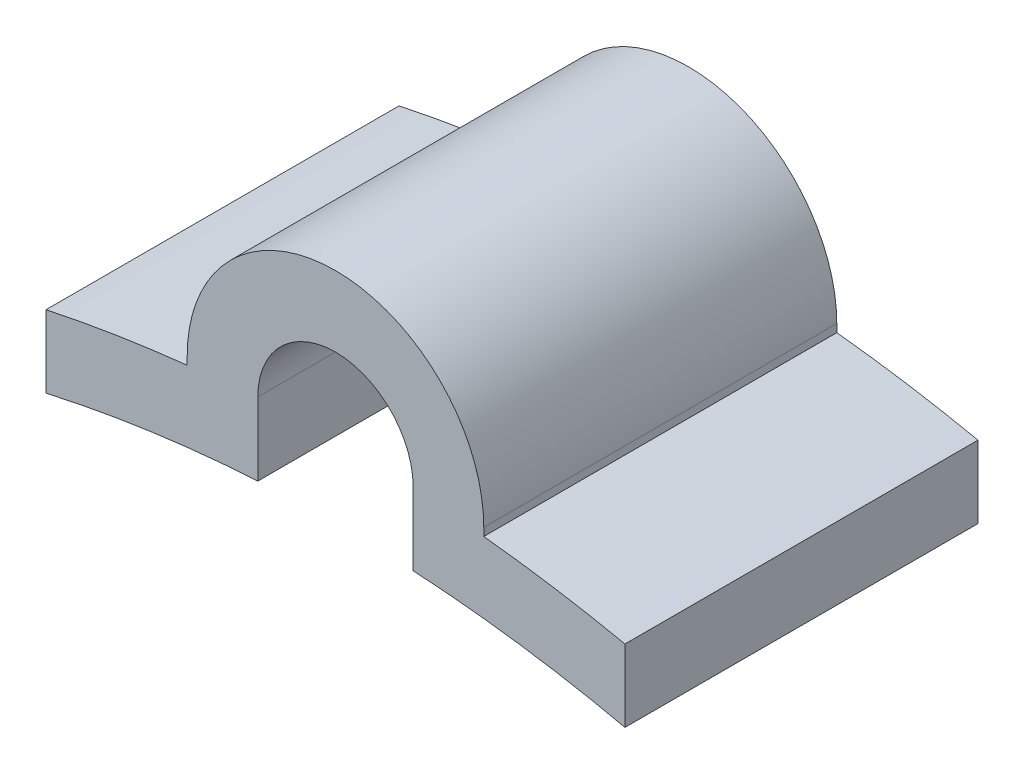
ISO-10303-21;
HEADER;
FILE_DESCRIPTION(('STEP AP214'),'2;1');
FILE_NAME('part.step','',(''),(''),'','','');
FILE_SCHEMA(('AUTOMOTIVE_DESIGN { 1 0 10303 214 1 1 1 1 }'));
ENDSEC;
DATA;
#1=APPLICATION_CONTEXT('core data for automotive mechanical design processes');
#2=APPLICATION_PROTOCOL_DEFINITION('international standard','automotive_design',2000,#1);
#3=PRODUCT_CONTEXT('',#1,'mechanical');
#4=PRODUCT('Part','Part','',(#3));
#5=PRODUCT_RELATED_PRODUCT_CATEGORY('part','',(#4));
#6=PRODUCT_DEFINITION_FORMATION('','',#4);
#7=PRODUCT_DEFINITION_CONTEXT('part definition',#1,'design');
#8=PRODUCT_DEFINITION('design','',#6,#7);
#9=PRODUCT_DEFINITION_SHAPE('','',#8);
#10=(LENGTH_UNIT() NAMED_UNIT(*) SI_UNIT(.MILLI.,.METRE.));
#11=(NAMED_UNIT(*) PLANE_ANGLE_UNIT() SI_UNIT($,.RADIAN.));
#12=(NAMED_UNIT(*) SI_UNIT($,.STERADIAN.) SOLID_ANGLE_UNIT());
#13=UNCERTAINTY_MEASURE_WITH_UNIT(LENGTH_MEASURE(1.E-05),#10,'distance_accuracy_value','');
#14=(GEOMETRIC_REPRESENTATION_CONTEXT(3) GLOBAL_UNCERTAINTY_ASSIGNED_CONTEXT((#13)) GLOBAL_UNIT_ASSIGNED_CONTEXT((#10,
#11,#12)) REPRESENTATION_CONTEXT('',''));
#15=CARTESIAN_POINT('',(0.,0.,0.));
#16=DIRECTION('',(0.,0.,1.));
#17=DIRECTION('',(1.,0.,0.));
#18=AXIS2_PLACEMENT_3D('',#15,#16,#17);
#19=CARTESIAN_POINT('',(4.2,0.,10.));
#20=DIRECTION('',(1.,0.,0.));
#21=DIRECTION('',(0.,0.,-1.));
#22=AXIS2_PLACEMENT_3D('',#19,#20,#21);
#23=PLANE('',#22);
#24=DIRECTION('',(0.,-1.,0.));
#25=VECTOR('',#24,1.);
#26=CARTESIAN_POINT('',(4.2,0.,0.));
#27=LINE('',#26,#25);
#28=CARTESIAN_POINT('',(4.2,0.,0.));
#29=VERTEX_POINT('',#28);
#30=CARTESIAN_POINT('',(4.2,-0.223925858100327,0.));
#31=VERTEX_POINT('',#30);
#32=EDGE_CURVE('E159',#29,#31,#27,.T.);
#33=ORIENTED_EDGE('',*,*,#32,.F.);
#34=DIRECTION('',(0.,0.,-1.));
#35=VECTOR('',#34,1.);
#36=CARTESIAN_POINT('',(4.2,0.,10.));
#37=LINE('',#36,#35);
#38=CARTESIAN_POINT('',(4.2,0.,10.));
#39=VERTEX_POINT('',#38);
#40=EDGE_CURVE('E11',#39,#29,#37,.T.);
#41=ORIENTED_EDGE('',*,*,#40,.F.);
#42=DIRECTION('',(0.,-1.,0.));
#43=VECTOR('',#42,1.);
#44=CARTESIAN_POINT('',(4.2,0.,10.));
#45=LINE('',#44,#43);
#46=CARTESIAN_POINT('',(4.2,-0.223925858100327,10.));
#47=VERTEX_POINT('',#46);
#48=EDGE_CURVE('E189',#39,#47,#45,.T.);
#49=ORIENTED_EDGE('',*,*,#48,.T.);
#50=DIRECTION('',(0.,0.,-1.));
#51=VECTOR('',#50,1.);
#52=CARTESIAN_POINT('',(4.2,-0.223925858100327,10.));
#53=LINE('',#52,#51);
#54=EDGE_CURVE('E40',#47,#31,#53,.T.);
#55=ORIENTED_EDGE('',*,*,#54,.T.);
#56=EDGE_LOOP('',(#33,#41,#49,#55));
#57=FACE_BOUND('',#56,.T.);
#58=ADVANCED_FACE('F37',(#57),#23,.T.);
#59=CARTESIAN_POINT('',(0.,0.,10.));
#60=DIRECTION('',(0.,0.,-1.));
#61=DIRECTION('',(-1.,0.,0.));
#62=AXIS2_PLACEMENT_3D('',#59,#60,#61);
#63=CYLINDRICAL_SURFACE('',#62,4.2);
#64=CARTESIAN_POINT('',(0.,0.,0.));
#65=DIRECTION('',(0.,0.,1.));
#66=DIRECTION('',(1.,0.,0.));
#67=AXIS2_PLACEMENT_3D('',#64,#65,#66);
#68=CIRCLE('',#67,4.2);
#69=CARTESIAN_POINT('',(-4.2,0.,0.));
#70=VERTEX_POINT('',#69);
#71=EDGE_CURVE('E94',#29,#70,#68,.T.);
#72=ORIENTED_EDGE('',*,*,#71,.T.);
#73=DIRECTION('',(0.,0.,-1.));
#74=VECTOR('',#73,1.);
#75=CARTESIAN_POINT('',(-4.2,0.,10.));
#76=LINE('',#75,#74);
#77=CARTESIAN_POINT('',(-4.2,0.,10.));
#78=VERTEX_POINT('',#77);
#79=EDGE_CURVE('E46',#78,#70,#76,.T.);
#80=ORIENTED_EDGE('',*,*,#79,.F.);
#81=CARTESIAN_POINT('',(0.,0.,10.));
#82=DIRECTION('',(0.,0.,1.));
#83=DIRECTION('',(1.,0.,0.));
#84=AXIS2_PLACEMENT_3D('',#81,#82,#83);
#85=CIRCLE('',#84,4.2);
#86=EDGE_CURVE('E137',#39,#78,#85,.T.);
#87=ORIENTED_EDGE('',*,*,#86,.F.);
#88=ORIENTED_EDGE('',*,*,#40,.T.);
#89=EDGE_LOOP('',(#72,#80,#87,#88));
#90=FACE_BOUND('',#89,.T.);
#91=ADVANCED_FACE('F263',(#90),#63,.T.);
#92=CARTESIAN_POINT('',(-4.2,0.,10.));
#93=DIRECTION('',(1.,0.,0.));
#94=DIRECTION('',(0.,0.,-1.));
#95=AXIS2_PLACEMENT_3D('',#92,#93,#94);
#96=PLANE('',#95);
#97=DIRECTION('',(0.,-1.,0.));
#98=VECTOR('',#97,1.);
#99=CARTESIAN_POINT('',(-4.2,0.,0.));
#100=LINE('',#99,#98);
#101=CARTESIAN_POINT('',(-4.2,-0.223925858100327,0.));
#102=VERTEX_POINT('',#101);
#103=EDGE_CURVE('E144',#70,#102,#100,.T.);
#104=ORIENTED_EDGE('',*,*,#103,.T.);
#105=DIRECTION('',(0.,0.,-1.));
#106=VECTOR('',#105,1.);
#107=CARTESIAN_POINT('',(-4.2,-0.223925858100327,10.));
#108=LINE('',#107,#106);
#109=CARTESIAN_POINT('',(-4.2,-0.223925858100327,10.));
#110=VERTEX_POINT('',#109);
#111=EDGE_CURVE('E141',#110,#102,#108,.T.);
#112=ORIENTED_EDGE('',*,*,#111,.F.);
#113=DIRECTION('',(0.,-1.,0.));
#114=VECTOR('',#113,1.);
#115=CARTESIAN_POINT('',(-4.2,0.,10.));
#116=LINE('',#115,#114);
#117=EDGE_CURVE('E131',#78,#110,#116,.T.);
#118=ORIENTED_EDGE('',*,*,#117,.F.);
#119=ORIENTED_EDGE('',*,*,#79,.T.);
#120=EDGE_LOOP('',(#104,#112,#118,#119));
#121=FACE_BOUND('',#120,.T.);
#122=ADVANCED_FACE('F142',(#121),#96,.F.);
#123=CARTESIAN_POINT('',(0.,-39.5,10.));
#124=DIRECTION('',(0.,0.,-1.));
#125=DIRECTION('',(-1.,0.,0.));
#126=AXIS2_PLACEMENT_3D('',#123,#124,#125);
#127=CYLINDRICAL_SURFACE('',#126,39.5);
#128=CARTESIAN_POINT('',(0.,-39.5,0.));
#129=DIRECTION('',(0.,0.,1.));
#130=DIRECTION('',(1.,0.,0.));
#131=AXIS2_PLACEMENT_3D('',#128,#129,#130);
#132=CIRCLE('',#131,39.5);
#133=CARTESIAN_POINT('',(-8.2,-0.860512425758027,0.));
#134=VERTEX_POINT('',#133);
#135=EDGE_CURVE('E186',#102,#134,#132,.T.);
#136=ORIENTED_EDGE('',*,*,#135,.T.);
#137=DIRECTION('',(0.,0.,-1.));
#138=VECTOR('',#137,1.);
#139=CARTESIAN_POINT('',(-8.2,-0.860512425758027,10.));
#140=LINE('',#139,#138);
#141=CARTESIAN_POINT('',(-8.2,-0.860512425758027,10.));
#142=VERTEX_POINT('',#141);
#143=EDGE_CURVE('E147',#142,#134,#140,.T.);
#144=ORIENTED_EDGE('',*,*,#143,.F.);
#145=CARTESIAN_POINT('',(0.,-39.5,10.));
#146=DIRECTION('',(0.,0.,1.));
#147=DIRECTION('',(1.,0.,0.));
#148=AXIS2_PLACEMENT_3D('',#145,#146,#147);
#149=CIRCLE('',#148,39.5);
#150=EDGE_CURVE('E135',#110,#142,#149,.T.);
#151=ORIENTED_EDGE('',*,*,#150,.F.);
#152=ORIENTED_EDGE('',*,*,#111,.T.);
#153=EDGE_LOOP('',(#136,#144,#151,#152));
#154=FACE_BOUND('',#153,.T.);
#155=ADVANCED_FACE('F149',(#154),#127,.T.);
#156=CARTESIAN_POINT('',(-8.2,-0.860512425758028,10.));
#157=DIRECTION('',(1.,0.,0.));
#158=DIRECTION('',(0.,0.,-1.));
#159=AXIS2_PLACEMENT_3D('',#156,#157,#158);
#160=PLANE('',#159);
#161=DIRECTION('',(0.,-1.,0.));
#162=VECTOR('',#161,1.);
#163=CARTESIAN_POINT('',(-8.2,-0.860512425758028,0.));
#164=LINE('',#163,#162);
#165=CARTESIAN_POINT('',(-8.2,-2.90751443260516,0.));
#166=VERTEX_POINT('',#165);
#167=EDGE_CURVE('E183',#134,#166,#164,.T.);
#168=ORIENTED_EDGE('',*,*,#167,.T.);
#169=DIRECTION('',(0.,0.,-1.));
#170=VECTOR('',#169,1.);
#171=CARTESIAN_POINT('',(-8.2,-2.90751443260516,10.));
#172=LINE('',#171,#170);
#173=CARTESIAN_POINT('',(-8.2,-2.90751443260516,10.));
#174=VERTEX_POINT('',#173);
#175=EDGE_CURVE('E193',#174,#166,#172,.T.);
#176=ORIENTED_EDGE('',*,*,#175,.F.);
#177=DIRECTION('',(0.,-1.,0.));
#178=VECTOR('',#177,1.);
#179=CARTESIAN_POINT('',(-8.2,-0.860512425758028,10.));
#180=LINE('',#179,#178);
#181=EDGE_CURVE('E152',#142,#174,#180,.T.);
#182=ORIENTED_EDGE('',*,*,#181,.F.);
#183=ORIENTED_EDGE('',*,*,#143,.T.);
#184=EDGE_LOOP('',(#168,#176,#182,#183));
#185=FACE_BOUND('',#184,.T.);
#186=ADVANCED_FACE('F213',(#185),#160,.F.);
#187=CARTESIAN_POINT('',(0.,-39.5,10.));
#188=DIRECTION('',(0.,0.,-1.));
#189=DIRECTION('',(-1.,0.,0.));
#190=AXIS2_PLACEMENT_3D('',#187,#188,#189);
#191=CYLINDRICAL_SURFACE('',#190,37.5);
#192=CARTESIAN_POINT('',(0.,-39.5,0.));
#193=DIRECTION('',(0.,0.,1.));
#194=DIRECTION('',(1.,0.,0.));
#195=AXIS2_PLACEMENT_3D('',#192,#193,#194);
#196=CIRCLE('',#195,37.5);
#197=CARTESIAN_POINT('',(-2.2,-2.06458895644393,0.));
#198=VERTEX_POINT('',#197);
#199=EDGE_CURVE('E180',#198,#166,#196,.T.);
#200=ORIENTED_EDGE('',*,*,#199,.F.);
#201=DIRECTION('',(0.,0.,-1.));
#202=VECTOR('',#201,1.);
#203=CARTESIAN_POINT('',(-2.2,-2.06458895644393,10.));
#204=LINE('',#203,#202);
#205=CARTESIAN_POINT('',(-2.2,-2.06458895644393,10.));
#206=VERTEX_POINT('',#205);
#207=EDGE_CURVE('E195',#206,#198,#204,.T.);
#208=ORIENTED_EDGE('',*,*,#207,.F.);
#209=CARTESIAN_POINT('',(0.,-39.5,10.));
#210=DIRECTION('',(0.,0.,1.));
#211=DIRECTION('',(1.,0.,0.));
#212=AXIS2_PLACEMENT_3D('',#209,#210,#211);
#213=CIRCLE('',#212,37.5);
#214=EDGE_CURVE('E154',#206,#174,#213,.T.);
#215=ORIENTED_EDGE('',*,*,#214,.T.);
#216=ORIENTED_EDGE('',*,*,#175,.T.);
#217=EDGE_LOOP('',(#200,#208,#215,#216));
#218=FACE_BOUND('',#217,.T.);
#219=ADVANCED_FACE('F253',(#218),#191,.F.);
#220=CARTESIAN_POINT('',(-2.2,0.,10.));
#221=DIRECTION('',(1.,0.,0.));
#222=DIRECTION('',(0.,1.,0.));
#223=AXIS2_PLACEMENT_3D('',#220,#221,#222);
#224=PLANE('',#223);
#225=DIRECTION('',(0.,-1.,0.));
#226=VECTOR('',#225,1.);
#227=CARTESIAN_POINT('',(-2.2,0.,0.));
#228=LINE('',#227,#226);
#229=CARTESIAN_POINT('',(-2.2,0.,0.));
#230=VERTEX_POINT('',#229);
#231=EDGE_CURVE('E177',#230,#198,#228,.T.);
#232=ORIENTED_EDGE('',*,*,#231,.F.);
#233=DIRECTION('',(0.,0.,-1.));
#234=VECTOR('',#233,1.);
#235=CARTESIAN_POINT('',(-2.2,0.,10.));
#236=LINE('',#235,#234);
#237=CARTESIAN_POINT('',(-2.2,0.,10.));
#238=VERTEX_POINT('',#237);
#239=EDGE_CURVE('E197',#238,#230,#236,.T.);
#240=ORIENTED_EDGE('',*,*,#239,.F.);
#241=DIRECTION('',(0.,-1.,0.));
#242=VECTOR('',#241,1.);
#243=CARTESIAN_POINT('',(-2.2,0.,10.));
#244=LINE('',#243,#242);
#245=EDGE_CURVE('E220',#238,#206,#244,.T.);
#246=ORIENTED_EDGE('',*,*,#245,.T.);
#247=ORIENTED_EDGE('',*,*,#207,.T.);
#248=EDGE_LOOP('',(#232,#240,#246,#247));
#249=FACE_BOUND('',#248,.T.);
#250=ADVANCED_FACE('F225',(#249),#224,.T.);
#251=CARTESIAN_POINT('',(0.,0.,10.));
#252=DIRECTION('',(0.,0.,-1.));
#253=DIRECTION('',(-1.,0.,0.));
#254=AXIS2_PLACEMENT_3D('',#251,#252,#253);
#255=CYLINDRICAL_SURFACE('',#254,2.2);
#256=CARTESIAN_POINT('',(0.,0.,0.));
#257=DIRECTION('',(0.,0.,1.));
#258=DIRECTION('',(1.,0.,0.));
#259=AXIS2_PLACEMENT_3D('',#256,#257,#258);
#260=CIRCLE('',#259,2.2);
#261=CARTESIAN_POINT('',(2.2,0.,0.));
#262=VERTEX_POINT('',#261);
#263=EDGE_CURVE('E174',#262,#230,#260,.T.);
#264=ORIENTED_EDGE('',*,*,#263,.F.);
#265=DIRECTION('',(0.,0.,-1.));
#266=VECTOR('',#265,1.);
#267=CARTESIAN_POINT('',(2.2,0.,10.));
#268=LINE('',#267,#266);
#269=CARTESIAN_POINT('',(2.2,0.,10.));
#270=VERTEX_POINT('',#269);
#271=EDGE_CURVE('E199',#270,#262,#268,.T.);
#272=ORIENTED_EDGE('',*,*,#271,.F.);
#273=CARTESIAN_POINT('',(0.,0.,10.));
#274=DIRECTION('',(0.,0.,1.));
#275=DIRECTION('',(1.,0.,0.));
#276=AXIS2_PLACEMENT_3D('',#273,#274,#275);
#277=CIRCLE('',#276,2.2);
#278=EDGE_CURVE('E227',#270,#238,#277,.T.);
#279=ORIENTED_EDGE('',*,*,#278,.T.);
#280=ORIENTED_EDGE('',*,*,#239,.T.);
#281=EDGE_LOOP('',(#264,#272,#279,#280));
#282=FACE_BOUND('',#281,.T.);
#283=ADVANCED_FACE('F252',(#282),#255,.F.);
#284=CARTESIAN_POINT('',(2.2,0.,10.));
#285=DIRECTION('',(1.,0.,0.));
#286=DIRECTION('',(0.,1.,0.));
#287=AXIS2_PLACEMENT_3D('',#284,#285,#286);
#288=PLANE('',#287);
#289=DIRECTION('',(0.,-1.,0.));
#290=VECTOR('',#289,1.);
#291=CARTESIAN_POINT('',(2.2,0.,0.));
#292=LINE('',#291,#290);
#293=CARTESIAN_POINT('',(2.2,-2.06458895644393,0.));
#294=VERTEX_POINT('',#293);
#295=EDGE_CURVE('E171',#262,#294,#292,.T.);
#296=ORIENTED_EDGE('',*,*,#295,.T.);
#297=DIRECTION('',(0.,0.,-1.));
#298=VECTOR('',#297,1.);
#299=CARTESIAN_POINT('',(2.2,-2.06458895644393,10.));
#300=LINE('',#299,#298);
#301=CARTESIAN_POINT('',(2.2,-2.06458895644393,10.));
#302=VERTEX_POINT('',#301);
#303=EDGE_CURVE('E201',#302,#294,#300,.T.);
#304=ORIENTED_EDGE('',*,*,#303,.F.);
#305=DIRECTION('',(0.,-1.,0.));
#306=VECTOR('',#305,1.);
#307=CARTESIAN_POINT('',(2.2,0.,10.));
#308=LINE('',#307,#306);
#309=EDGE_CURVE('E229',#270,#302,#308,.T.);
#310=ORIENTED_EDGE('',*,*,#309,.F.);
#311=ORIENTED_EDGE('',*,*,#271,.T.);
#312=EDGE_LOOP('',(#296,#304,#310,#311));
#313=FACE_BOUND('',#312,.T.);
#314=ADVANCED_FACE('F303',(#313),#288,.F.);
#315=CARTESIAN_POINT('',(0.,-39.5,10.));
#316=DIRECTION('',(0.,0.,-1.));
#317=DIRECTION('',(-1.,0.,0.));
#318=AXIS2_PLACEMENT_3D('',#315,#316,#317);
#319=CYLINDRICAL_SURFACE('',#318,37.5);
#320=CARTESIAN_POINT('',(0.,-39.5,0.));
#321=DIRECTION('',(0.,0.,1.));
#322=DIRECTION('',(1.,0.,0.));
#323=AXIS2_PLACEMENT_3D('',#320,#321,#322);
#324=CIRCLE('',#323,37.5);
#325=CARTESIAN_POINT('',(8.2,-2.90751443260517,0.));
#326=VERTEX_POINT('',#325);
#327=EDGE_CURVE('E168',#326,#294,#324,.T.);
#328=ORIENTED_EDGE('',*,*,#327,.F.);
#329=DIRECTION('',(0.,0.,-1.));
#330=VECTOR('',#329,1.);
#331=CARTESIAN_POINT('',(8.2,-2.90751443260517,10.));
#332=LINE('',#331,#330);
#333=CARTESIAN_POINT('',(8.2,-2.90751443260517,10.));
#334=VERTEX_POINT('',#333);
#335=EDGE_CURVE('E203',#334,#326,#332,.T.);
#336=ORIENTED_EDGE('',*,*,#335,.F.);
#337=CARTESIAN_POINT('',(0.,-39.5,10.));
#338=DIRECTION('',(0.,0.,1.));
#339=DIRECTION('',(1.,0.,0.));
#340=AXIS2_PLACEMENT_3D('',#337,#338,#339);
#341=CIRCLE('',#340,37.5);
#342=EDGE_CURVE('E233',#334,#302,#341,.T.);
#343=ORIENTED_EDGE('',*,*,#342,.T.);
#344=ORIENTED_EDGE('',*,*,#303,.T.);
#345=EDGE_LOOP('',(#328,#336,#343,#344));
#346=FACE_BOUND('',#345,.T.);
#347=ADVANCED_FACE('F247',(#346),#319,.F.);
#348=CARTESIAN_POINT('',(8.2,-0.860512425758026,10.));
#349=DIRECTION('',(1.,0.,0.));
#350=DIRECTION('',(0.,0.,-1.));
#351=AXIS2_PLACEMENT_3D('',#348,#349,#350);
#352=PLANE('',#351);
#353=DIRECTION('',(0.,-1.,0.));
#354=VECTOR('',#353,1.);
#355=CARTESIAN_POINT('',(8.2,-0.860512425758026,0.));
#356=LINE('',#355,#354);
#357=CARTESIAN_POINT('',(8.2,-0.860512425758026,0.));
#358=VERTEX_POINT('',#357);
#359=EDGE_CURVE('E165',#358,#326,#356,.T.);
#360=ORIENTED_EDGE('',*,*,#359,.F.);
#361=DIRECTION('',(0.,0.,-1.));
#362=VECTOR('',#361,1.);
#363=CARTESIAN_POINT('',(8.2,-0.860512425758026,10.));
#364=LINE('',#363,#362);
#365=CARTESIAN_POINT('',(8.2,-0.860512425758026,10.));
#366=VERTEX_POINT('',#365);
#367=EDGE_CURVE('E204',#366,#358,#364,.T.);
#368=ORIENTED_EDGE('',*,*,#367,.F.);
#369=DIRECTION('',(0.,-1.,0.));
#370=VECTOR('',#369,1.);
#371=CARTESIAN_POINT('',(8.2,-0.860512425758026,10.));
#372=LINE('',#371,#370);
#373=EDGE_CURVE('E236',#366,#334,#372,.T.);
#374=ORIENTED_EDGE('',*,*,#373,.T.);
#375=ORIENTED_EDGE('',*,*,#335,.T.);
#376=EDGE_LOOP('',(#360,#368,#374,#375));
#377=FACE_BOUND('',#376,.T.);
#378=ADVANCED_FACE('F241',(#377),#352,.T.);
#379=CARTESIAN_POINT('',(0.,-39.5,10.));
#380=DIRECTION('',(0.,0.,-1.));
#381=DIRECTION('',(-1.,0.,0.));
#382=AXIS2_PLACEMENT_3D('',#379,#380,#381);
#383=CYLINDRICAL_SURFACE('',#382,39.5);
#384=CARTESIAN_POINT('',(0.,-39.5,0.));
#385=DIRECTION('',(0.,0.,1.));
#386=DIRECTION('',(1.,0.,0.));
#387=AXIS2_PLACEMENT_3D('',#384,#385,#386);
#388=CIRCLE('',#387,39.5);
#389=EDGE_CURVE('E162',#358,#31,#388,.T.);
#390=ORIENTED_EDGE('',*,*,#389,.T.);
#391=ORIENTED_EDGE('',*,*,#54,.F.);
#392=CARTESIAN_POINT('',(0.,-39.5,10.));
#393=DIRECTION('',(0.,0.,1.));
#394=DIRECTION('',(1.,0.,0.));
#395=AXIS2_PLACEMENT_3D('',#392,#393,#394);
#396=CIRCLE('',#395,39.5);
#397=EDGE_CURVE('E104',#366,#47,#396,.T.);
#398=ORIENTED_EDGE('',*,*,#397,.F.);
#399=ORIENTED_EDGE('',*,*,#367,.T.);
#400=EDGE_LOOP('',(#390,#391,#398,#399));
#401=FACE_BOUND('',#400,.T.);
#402=ADVANCED_FACE('F207',(#401),#383,.T.);
#403=CARTESIAN_POINT('',(0.,-39.5,10.));
#404=DIRECTION('',(0.,0.,1.));
#405=DIRECTION('',(1.,0.,0.));
#406=AXIS2_PLACEMENT_3D('',#403,#404,#405);
#407=PLANE('',#406);
#408=ORIENTED_EDGE('',*,*,#48,.F.);
#409=ORIENTED_EDGE('',*,*,#86,.T.);
#410=ORIENTED_EDGE('',*,*,#117,.T.);
#411=ORIENTED_EDGE('',*,*,#150,.T.);
#412=ORIENTED_EDGE('',*,*,#181,.T.);
#413=ORIENTED_EDGE('',*,*,#214,.F.);
#414=ORIENTED_EDGE('',*,*,#245,.F.);
#415=ORIENTED_EDGE('',*,*,#278,.F.);
#416=ORIENTED_EDGE('',*,*,#309,.T.);
#417=ORIENTED_EDGE('',*,*,#342,.F.);
#418=ORIENTED_EDGE('',*,*,#373,.F.);
#419=ORIENTED_EDGE('',*,*,#397,.T.);
#420=EDGE_LOOP('',(#408,#409,#410,#411,#412,#413,#414,#415,#416,#417,#418,#419));
#421=FACE_BOUND('',#420,.T.);
#422=ADVANCED_FACE('F133',(#421),#407,.T.);
#423=CARTESIAN_POINT('',(0.,-39.5,0.));
#424=DIRECTION('',(0.,0.,1.));
#425=DIRECTION('',(1.,0.,0.));
#426=AXIS2_PLACEMENT_3D('',#423,#424,#425);
#427=PLANE('',#426);
#428=ORIENTED_EDGE('',*,*,#32,.T.);
#429=ORIENTED_EDGE('',*,*,#389,.F.);
#430=ORIENTED_EDGE('',*,*,#359,.T.);
#431=ORIENTED_EDGE('',*,*,#327,.T.);
#432=ORIENTED_EDGE('',*,*,#295,.F.);
#433=ORIENTED_EDGE('',*,*,#263,.T.);
#434=ORIENTED_EDGE('',*,*,#231,.T.);
#435=ORIENTED_EDGE('',*,*,#199,.T.);
#436=ORIENTED_EDGE('',*,*,#167,.F.);
#437=ORIENTED_EDGE('',*,*,#135,.F.);
#438=ORIENTED_EDGE('',*,*,#103,.F.);
#439=ORIENTED_EDGE('',*,*,#71,.F.);
#440=EDGE_LOOP('',(#428,#429,#430,#431,#432,#433,#434,#435,#436,#437,#438,#439));
#441=FACE_BOUND('',#440,.T.);
#442=ADVANCED_FACE('F210',(#441),#427,.F.);
#443=CLOSED_SHELL('',(#58,#91,#122,#155,#186,#219,#250,#283,#314,#347,#378,#402,#422,#442));
#444=MANIFOLD_SOLID_BREP('B2',#443);
#445=ADVANCED_BREP_SHAPE_REPRESENTATION('',(#18,#444),#14);
#446=SHAPE_DEFINITION_REPRESENTATION(#9,#445);
ENDSEC;
END-ISO-10303-21;
